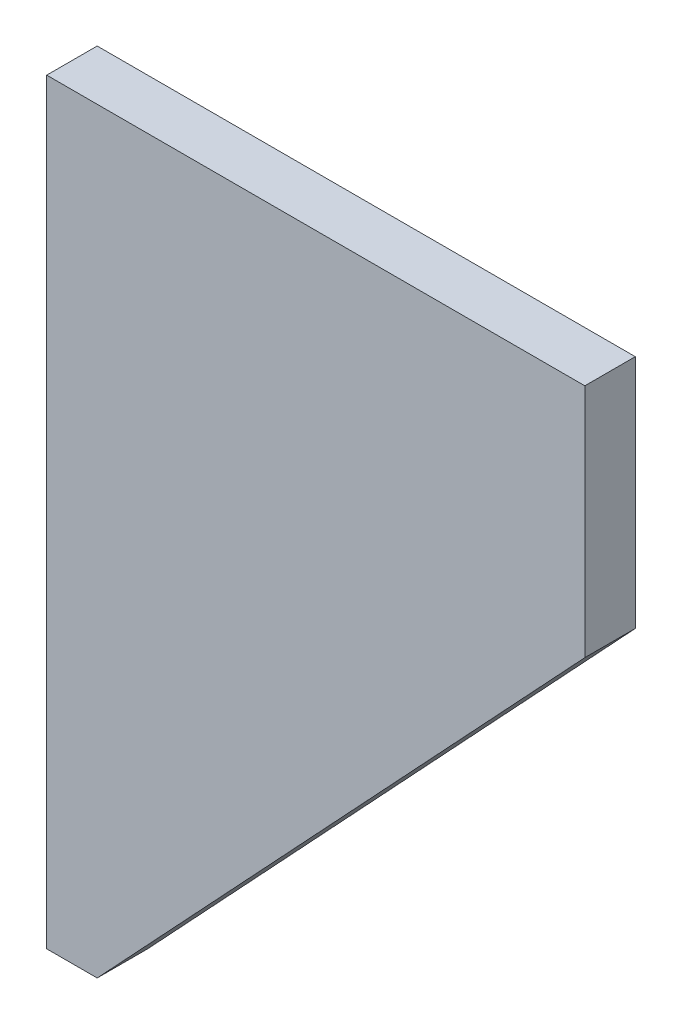
ISO-10303-21;
HEADER;
FILE_DESCRIPTION(('STEP AP214'),'2;1');
FILE_NAME('part.step','',(''),(''),'','','');
FILE_SCHEMA(('AUTOMOTIVE_DESIGN { 1 0 10303 214 1 1 1 1 }'));
ENDSEC;
DATA;
#1=APPLICATION_CONTEXT('core data for automotive mechanical design processes');
#2=APPLICATION_PROTOCOL_DEFINITION('international standard','automotive_design',2000,#1);
#3=PRODUCT_CONTEXT('',#1,'mechanical');
#4=PRODUCT('Part','Part','',(#3));
#5=PRODUCT_RELATED_PRODUCT_CATEGORY('part','',(#4));
#6=PRODUCT_DEFINITION_FORMATION('','',#4);
#7=PRODUCT_DEFINITION_CONTEXT('part definition',#1,'design');
#8=PRODUCT_DEFINITION('design','',#6,#7);
#9=PRODUCT_DEFINITION_SHAPE('','',#8);
#10=(LENGTH_UNIT() NAMED_UNIT(*) SI_UNIT(.MILLI.,.METRE.));
#11=(NAMED_UNIT(*) PLANE_ANGLE_UNIT() SI_UNIT($,.RADIAN.));
#12=(NAMED_UNIT(*) SI_UNIT($,.STERADIAN.) SOLID_ANGLE_UNIT());
#13=UNCERTAINTY_MEASURE_WITH_UNIT(LENGTH_MEASURE(1.E-05),#10,'distance_accuracy_value','');
#14=(GEOMETRIC_REPRESENTATION_CONTEXT(3) GLOBAL_UNCERTAINTY_ASSIGNED_CONTEXT((#13)) GLOBAL_UNIT_ASSIGNED_CONTEXT((#10,
#11,#12)) REPRESENTATION_CONTEXT('',''));
#15=CARTESIAN_POINT('',(0.,0.,0.));
#16=DIRECTION('',(0.,0.,1.));
#17=DIRECTION('',(1.,0.,0.));
#18=AXIS2_PLACEMENT_3D('',#15,#16,#17);
#19=CARTESIAN_POINT('',(19.05,0.,19.05));
#20=DIRECTION('',(0.,1.,0.));
#21=DIRECTION('',(-1.,0.,0.));
#22=AXIS2_PLACEMENT_3D('',#19,#20,#21);
#23=PLANE('',#22);
#24=DIRECTION('',(1.,0.,0.));
#25=VECTOR('',#24,1.);
#26=CARTESIAN_POINT('',(19.05,0.,0.));
#27=LINE('',#26,#25);
#28=CARTESIAN_POINT('',(0.,0.,0.));
#29=VERTEX_POINT('',#28);
#30=CARTESIAN_POINT('',(19.05,0.,0.));
#31=VERTEX_POINT('',#30);
#32=EDGE_CURVE('E111',#29,#31,#27,.T.);
#33=ORIENTED_EDGE('',*,*,#32,.T.);
#34=DIRECTION('',(0.,0.,-1.));
#35=VECTOR('',#34,1.);
#36=CARTESIAN_POINT('',(19.05,0.,19.05));
#37=LINE('',#36,#35);
#38=CARTESIAN_POINT('',(19.05,0.,19.05));
#39=VERTEX_POINT('',#38);
#40=EDGE_CURVE('E11',#39,#31,#37,.T.);
#41=ORIENTED_EDGE('',*,*,#40,.F.);
#42=DIRECTION('',(1.,0.,0.));
#43=VECTOR('',#42,1.);
#44=CARTESIAN_POINT('',(19.05,0.,19.05));
#45=LINE('',#44,#43);
#46=CARTESIAN_POINT('',(0.,0.,19.05));
#47=VERTEX_POINT('',#46);
#48=EDGE_CURVE('E119',#47,#39,#45,.T.);
#49=ORIENTED_EDGE('',*,*,#48,.F.);
#50=DIRECTION('',(0.,0.,-1.));
#51=VECTOR('',#50,1.);
#52=CARTESIAN_POINT('',(0.,0.,19.05));
#53=LINE('',#52,#51);
#54=EDGE_CURVE('E107',#47,#29,#53,.T.);
#55=ORIENTED_EDGE('',*,*,#54,.T.);
#56=EDGE_LOOP('',(#33,#41,#49,#55));
#57=FACE_BOUND('',#56,.T.);
#58=ADVANCED_FACE('F37',(#57),#23,.F.);
#59=CARTESIAN_POINT('',(203.2,196.85,19.05));
#60=DIRECTION('',(-0.730271413518896,0.683157128775741,0.));
#61=DIRECTION('',(-0.683157128775741,-0.730271413518896,0.));
#62=AXIS2_PLACEMENT_3D('',#59,#60,#61);
#63=PLANE('',#62);
#64=DIRECTION('',(0.683157128775741,0.730271413518895,0.));
#65=VECTOR('',#64,1.);
#66=CARTESIAN_POINT('',(203.2,196.85,0.));
#67=LINE('',#66,#65);
#68=CARTESIAN_POINT('',(203.2,196.85,0.));
#69=VERTEX_POINT('',#68);
#70=EDGE_CURVE('E114',#31,#69,#67,.T.);
#71=ORIENTED_EDGE('',*,*,#70,.T.);
#72=DIRECTION('',(0.,0.,-1.));
#73=VECTOR('',#72,1.);
#74=CARTESIAN_POINT('',(203.2,196.85,19.05));
#75=LINE('',#74,#73);
#76=CARTESIAN_POINT('',(203.2,196.85,19.05));
#77=VERTEX_POINT('',#76);
#78=EDGE_CURVE('E45',#77,#69,#75,.T.);
#79=ORIENTED_EDGE('',*,*,#78,.F.);
#80=DIRECTION('',(0.683157128775741,0.730271413518895,0.));
#81=VECTOR('',#80,1.);
#82=CARTESIAN_POINT('',(203.2,196.85,19.05));
#83=LINE('',#82,#81);
#84=EDGE_CURVE('E87',#39,#77,#83,.T.);
#85=ORIENTED_EDGE('',*,*,#84,.F.);
#86=ORIENTED_EDGE('',*,*,#40,.T.);
#87=EDGE_LOOP('',(#71,#79,#85,#86));
#88=FACE_BOUND('',#87,.T.);
#89=ADVANCED_FACE('F138',(#88),#63,.F.);
#90=CARTESIAN_POINT('',(203.2,285.75,19.05));
#91=DIRECTION('',(-1.,0.,0.));
#92=DIRECTION('',(0.,-1.,0.));
#93=AXIS2_PLACEMENT_3D('',#90,#91,#92);
#94=PLANE('',#93);
#95=DIRECTION('',(0.,1.,0.));
#96=VECTOR('',#95,1.);
#97=CARTESIAN_POINT('',(203.2,285.75,0.));
#98=LINE('',#97,#96);
#99=CARTESIAN_POINT('',(203.2,285.75,0.));
#100=VERTEX_POINT('',#99);
#101=EDGE_CURVE('E102',#69,#100,#98,.T.);
#102=ORIENTED_EDGE('',*,*,#101,.T.);
#103=DIRECTION('',(0.,0.,-1.));
#104=VECTOR('',#103,1.);
#105=CARTESIAN_POINT('',(203.2,285.75,19.05));
#106=LINE('',#105,#104);
#107=CARTESIAN_POINT('',(203.2,285.75,19.05));
#108=VERTEX_POINT('',#107);
#109=EDGE_CURVE('E99',#108,#100,#106,.T.);
#110=ORIENTED_EDGE('',*,*,#109,.F.);
#111=DIRECTION('',(0.,1.,0.));
#112=VECTOR('',#111,1.);
#113=CARTESIAN_POINT('',(203.2,285.75,19.05));
#114=LINE('',#113,#112);
#115=EDGE_CURVE('E91',#77,#108,#114,.T.);
#116=ORIENTED_EDGE('',*,*,#115,.F.);
#117=ORIENTED_EDGE('',*,*,#78,.T.);
#118=EDGE_LOOP('',(#102,#110,#116,#117));
#119=FACE_BOUND('',#118,.T.);
#120=ADVANCED_FACE('F100',(#119),#94,.F.);
#121=CARTESIAN_POINT('',(0.,285.75,19.05));
#122=DIRECTION('',(0.,-1.,0.));
#123=DIRECTION('',(0.,0.,-1.));
#124=AXIS2_PLACEMENT_3D('',#121,#122,#123);
#125=PLANE('',#124);
#126=DIRECTION('',(-1.,0.,0.));
#127=VECTOR('',#126,1.);
#128=CARTESIAN_POINT('',(0.,285.75,0.));
#129=LINE('',#128,#127);
#130=CARTESIAN_POINT('',(0.,285.75,0.));
#131=VERTEX_POINT('',#130);
#132=EDGE_CURVE('E73',#100,#131,#129,.T.);
#133=ORIENTED_EDGE('',*,*,#132,.T.);
#134=DIRECTION('',(0.,0.,-1.));
#135=VECTOR('',#134,1.);
#136=CARTESIAN_POINT('',(0.,285.75,19.05));
#137=LINE('',#136,#135);
#138=CARTESIAN_POINT('',(0.,285.75,19.05));
#139=VERTEX_POINT('',#138);
#140=EDGE_CURVE('E103',#139,#131,#137,.T.);
#141=ORIENTED_EDGE('',*,*,#140,.F.);
#142=DIRECTION('',(-1.,0.,0.));
#143=VECTOR('',#142,1.);
#144=CARTESIAN_POINT('',(0.,285.75,19.05));
#145=LINE('',#144,#143);
#146=EDGE_CURVE('E95',#108,#139,#145,.T.);
#147=ORIENTED_EDGE('',*,*,#146,.F.);
#148=ORIENTED_EDGE('',*,*,#109,.T.);
#149=EDGE_LOOP('',(#133,#141,#147,#148));
#150=FACE_BOUND('',#149,.T.);
#151=ADVANCED_FACE('F105',(#150),#125,.F.);
#152=CARTESIAN_POINT('',(0.,0.,19.05));
#153=DIRECTION('',(1.,0.,0.));
#154=DIRECTION('',(0.,0.,-1.));
#155=AXIS2_PLACEMENT_3D('',#152,#153,#154);
#156=PLANE('',#155);
#157=DIRECTION('',(0.,-1.,0.));
#158=VECTOR('',#157,1.);
#159=CARTESIAN_POINT('',(0.,0.,0.));
#160=LINE('',#159,#158);
#161=EDGE_CURVE('E79',#131,#29,#160,.T.);
#162=ORIENTED_EDGE('',*,*,#161,.T.);
#163=ORIENTED_EDGE('',*,*,#54,.F.);
#164=DIRECTION('',(0.,-1.,0.));
#165=VECTOR('',#164,1.);
#166=CARTESIAN_POINT('',(0.,0.,19.05));
#167=LINE('',#166,#165);
#168=EDGE_CURVE('E53',#139,#47,#167,.T.);
#169=ORIENTED_EDGE('',*,*,#168,.F.);
#170=ORIENTED_EDGE('',*,*,#140,.T.);
#171=EDGE_LOOP('',(#162,#163,#169,#170));
#172=FACE_BOUND('',#171,.T.);
#173=ADVANCED_FACE('F127',(#172),#156,.F.);
#174=CARTESIAN_POINT('',(0.,0.,19.05));
#175=DIRECTION('',(0.,0.,-1.));
#176=DIRECTION('',(-1.,0.,0.));
#177=AXIS2_PLACEMENT_3D('',#174,#175,#176);
#178=PLANE('',#177);
#179=ORIENTED_EDGE('',*,*,#48,.T.);
#180=ORIENTED_EDGE('',*,*,#84,.T.);
#181=ORIENTED_EDGE('',*,*,#115,.T.);
#182=ORIENTED_EDGE('',*,*,#146,.T.);
#183=ORIENTED_EDGE('',*,*,#168,.T.);
#184=EDGE_LOOP('',(#179,#180,#181,#182,#183));
#185=FACE_BOUND('',#184,.T.);
#186=ADVANCED_FACE('F93',(#185),#178,.F.);
#187=CARTESIAN_POINT('',(0.,0.,0.));
#188=DIRECTION('',(0.,0.,-1.));
#189=DIRECTION('',(-1.,0.,0.));
#190=AXIS2_PLACEMENT_3D('',#187,#188,#189);
#191=PLANE('',#190);
#192=ORIENTED_EDGE('',*,*,#32,.F.);
#193=ORIENTED_EDGE('',*,*,#161,.F.);
#194=ORIENTED_EDGE('',*,*,#132,.F.);
#195=ORIENTED_EDGE('',*,*,#101,.F.);
#196=ORIENTED_EDGE('',*,*,#70,.F.);
#197=EDGE_LOOP('',(#192,#193,#194,#195,#196));
#198=FACE_BOUND('',#197,.T.);
#199=ADVANCED_FACE('F123',(#198),#191,.T.);
#200=CLOSED_SHELL('',(#58,#89,#120,#151,#173,#186,#199));
#201=MANIFOLD_SOLID_BREP('B2',#200);
#202=ADVANCED_BREP_SHAPE_REPRESENTATION('',(#18,#201),#14);
#203=SHAPE_DEFINITION_REPRESENTATION(#9,#202);
ENDSEC;
END-ISO-10303-21;
